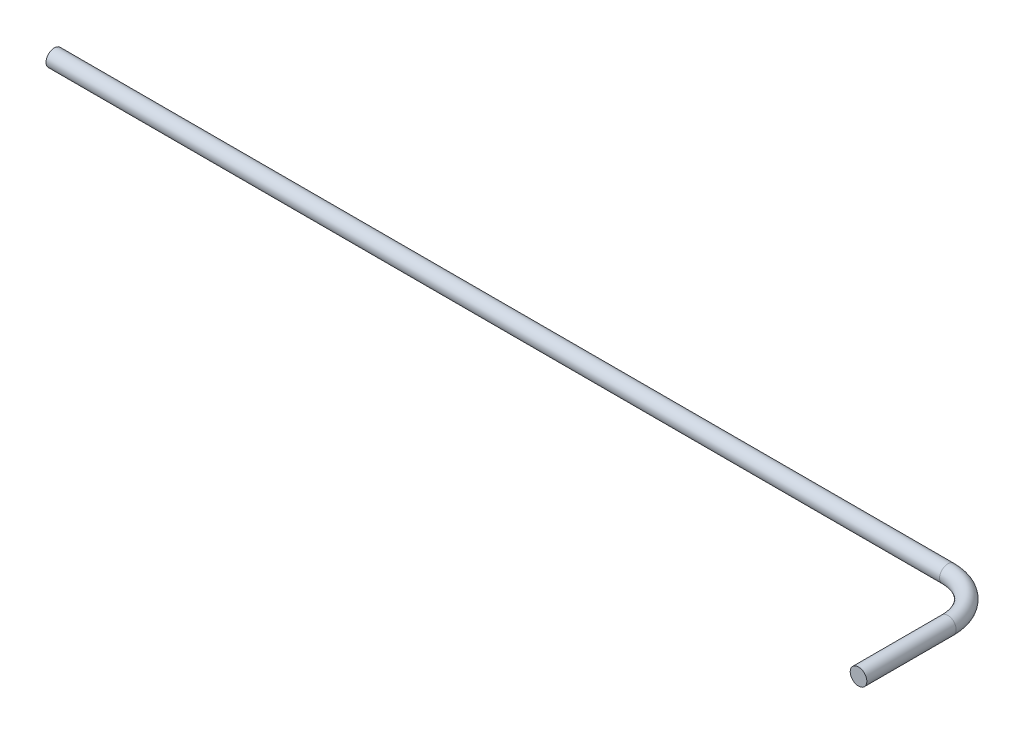
ISO-10303-21;
HEADER;
FILE_DESCRIPTION(('STEP AP214'),'2;1');
FILE_NAME('part.step','',(''),(''),'','','');
FILE_SCHEMA(('AUTOMOTIVE_DESIGN { 1 0 10303 214 1 1 1 1 }'));
ENDSEC;
DATA;
#1=APPLICATION_CONTEXT('core data for automotive mechanical design processes');
#2=APPLICATION_PROTOCOL_DEFINITION('international standard','automotive_design',2000,#1);
#3=PRODUCT_CONTEXT('',#1,'mechanical');
#4=PRODUCT('Part','Part','',(#3));
#5=PRODUCT_RELATED_PRODUCT_CATEGORY('part','',(#4));
#6=PRODUCT_DEFINITION_FORMATION('','',#4);
#7=PRODUCT_DEFINITION_CONTEXT('part definition',#1,'design');
#8=PRODUCT_DEFINITION('design','',#6,#7);
#9=PRODUCT_DEFINITION_SHAPE('','',#8);
#10=(LENGTH_UNIT() NAMED_UNIT(*) SI_UNIT(.MILLI.,.METRE.));
#11=(NAMED_UNIT(*) PLANE_ANGLE_UNIT() SI_UNIT($,.RADIAN.));
#12=(NAMED_UNIT(*) SI_UNIT($,.STERADIAN.) SOLID_ANGLE_UNIT());
#13=UNCERTAINTY_MEASURE_WITH_UNIT(LENGTH_MEASURE(1.E-05),#10,'distance_accuracy_value','');
#14=(GEOMETRIC_REPRESENTATION_CONTEXT(3) GLOBAL_UNCERTAINTY_ASSIGNED_CONTEXT((#13)) GLOBAL_UNIT_ASSIGNED_CONTEXT((#10,
#11,#12)) REPRESENTATION_CONTEXT('',''));
#15=CARTESIAN_POINT('',(0.,0.,0.));
#16=DIRECTION('',(0.,0.,1.));
#17=DIRECTION('',(1.,0.,0.));
#18=AXIS2_PLACEMENT_3D('',#15,#16,#17);
#19=CARTESIAN_POINT('',(0.,0.,-12.7));
#20=DIRECTION('',(0.,0.,1.));
#21=DIRECTION('',(1.,0.,0.));
#22=AXIS2_PLACEMENT_3D('',#19,#20,#21);
#23=CYLINDRICAL_SURFACE('',#22,1.1811);
#24=CARTESIAN_POINT('',(0.,0.,-12.7));
#25=DIRECTION('',(0.,0.,-1.));
#26=DIRECTION('',(-1.,0.,0.));
#27=AXIS2_PLACEMENT_3D('',#24,#25,#26);
#28=CIRCLE('',#27,1.1811);
#29=CARTESIAN_POINT('',(1.1811,0.,-12.7));
#30=VERTEX_POINT('',#29);
#31=EDGE_CURVE('E41',#30,#30,#28,.T.);
#32=ORIENTED_EDGE('',*,*,#31,.F.);
#33=EDGE_LOOP('',(#32));
#34=FACE_BOUND('',#33,.T.);
#35=CARTESIAN_POINT('',(0.,0.,0.));
#36=DIRECTION('',(0.,0.,1.));
#37=DIRECTION('',(1.,0.,0.));
#38=AXIS2_PLACEMENT_3D('',#35,#36,#37);
#39=CIRCLE('',#38,1.1811);
#40=CARTESIAN_POINT('',(1.1811,0.,0.));
#41=VERTEX_POINT('',#40);
#42=EDGE_CURVE('E10',#41,#41,#39,.T.);
#43=ORIENTED_EDGE('',*,*,#42,.F.);
#44=EDGE_LOOP('',(#43));
#45=FACE_BOUND('',#44,.T.);
#46=ADVANCED_FACE('F31',(#34,#45),#23,.T.);
#47=CARTESIAN_POINT('',(0.,0.,0.));
#48=DIRECTION('',(0.,0.,1.));
#49=DIRECTION('',(1.,0.,0.));
#50=AXIS2_PLACEMENT_3D('',#47,#48,#49);
#51=PLANE('',#50);
#52=ORIENTED_EDGE('',*,*,#42,.T.);
#53=EDGE_LOOP('',(#52));
#54=FACE_BOUND('',#53,.T.);
#55=ADVANCED_FACE('F62',(#54),#51,.T.);
#56=CARTESIAN_POINT('',(-6.35,0.,-12.7));
#57=DIRECTION('',(0.,-1.,0.));
#58=DIRECTION('',(0.,0.,-1.));
#59=AXIS2_PLACEMENT_3D('',#56,#57,#58);
#60=TOROIDAL_SURFACE('',#59,6.35,1.1811);
#61=CARTESIAN_POINT('',(-6.35000000000002,0.,-19.05));
#62=DIRECTION('',(-1.,0.,0.));
#63=DIRECTION('',(0.,0.,1.));
#64=AXIS2_PLACEMENT_3D('',#61,#62,#63);
#65=CIRCLE('',#64,1.1811);
#66=CARTESIAN_POINT('',(-6.35000000000003,0.,-20.2311));
#67=VERTEX_POINT('',#66);
#68=EDGE_CURVE('E37',#67,#67,#65,.T.);
#69=CARTESIAN_POINT('',(-6.35,0.,-12.7));
#70=DIRECTION('',(0.,-1.,0.));
#71=DIRECTION('',(0.,0.,-1.));
#72=AXIS2_PLACEMENT_3D('',#69,#70,#71);
#73=CIRCLE('',#72,7.5311);
#74=EDGE_CURVE('',#67,#30,#73,.T.);
#75=ORIENTED_EDGE('',*,*,#68,.F.);
#76=ORIENTED_EDGE('',*,*,#31,.T.);
#77=ORIENTED_EDGE('',*,*,#74,.T.);
#78=ORIENTED_EDGE('',*,*,#74,.F.);
#79=EDGE_LOOP('',(#75,#77,#76,#78));
#80=FACE_BOUND('',#79,.T.);
#81=ADVANCED_FACE('F55',(#80),#60,.T.);
#82=CARTESIAN_POINT('',(-133.35,0.,-19.0499999999996));
#83=DIRECTION('',(1.,0.,0.));
#84=DIRECTION('',(0.,0.,-1.));
#85=AXIS2_PLACEMENT_3D('',#82,#83,#84);
#86=CYLINDRICAL_SURFACE('',#85,1.1811);
#87=CARTESIAN_POINT('',(-133.35,0.,-19.0499999999996));
#88=DIRECTION('',(-1.,0.,0.));
#89=DIRECTION('',(0.,0.,1.));
#90=AXIS2_PLACEMENT_3D('',#87,#88,#89);
#91=CIRCLE('',#90,1.1811);
#92=CARTESIAN_POINT('',(-133.35,0.,-17.8688999999996));
#93=VERTEX_POINT('',#92);
#94=EDGE_CURVE('E45',#93,#93,#91,.T.);
#95=ORIENTED_EDGE('',*,*,#94,.F.);
#96=EDGE_LOOP('',(#95));
#97=FACE_BOUND('',#96,.T.);
#98=ORIENTED_EDGE('',*,*,#68,.T.);
#99=EDGE_LOOP('',(#98));
#100=FACE_BOUND('',#99,.T.);
#101=ADVANCED_FACE('F53',(#97,#100),#86,.T.);
#102=CARTESIAN_POINT('',(-133.35,0.,-19.0499999999996));
#103=DIRECTION('',(-1.,0.,0.));
#104=DIRECTION('',(0.,0.,1.));
#105=AXIS2_PLACEMENT_3D('',#102,#103,#104);
#106=PLANE('',#105);
#107=ORIENTED_EDGE('',*,*,#94,.T.);
#108=EDGE_LOOP('',(#107));
#109=FACE_BOUND('',#108,.T.);
#110=ADVANCED_FACE('F51',(#109),#106,.T.);
#111=CLOSED_SHELL('',(#46,#55,#81,#101,#110));
#112=MANIFOLD_SOLID_BREP('B2',#111);
#113=ADVANCED_BREP_SHAPE_REPRESENTATION('',(#18,#112),#14);
#114=SHAPE_DEFINITION_REPRESENTATION(#9,#113);
ENDSEC;
END-ISO-10303-21;
